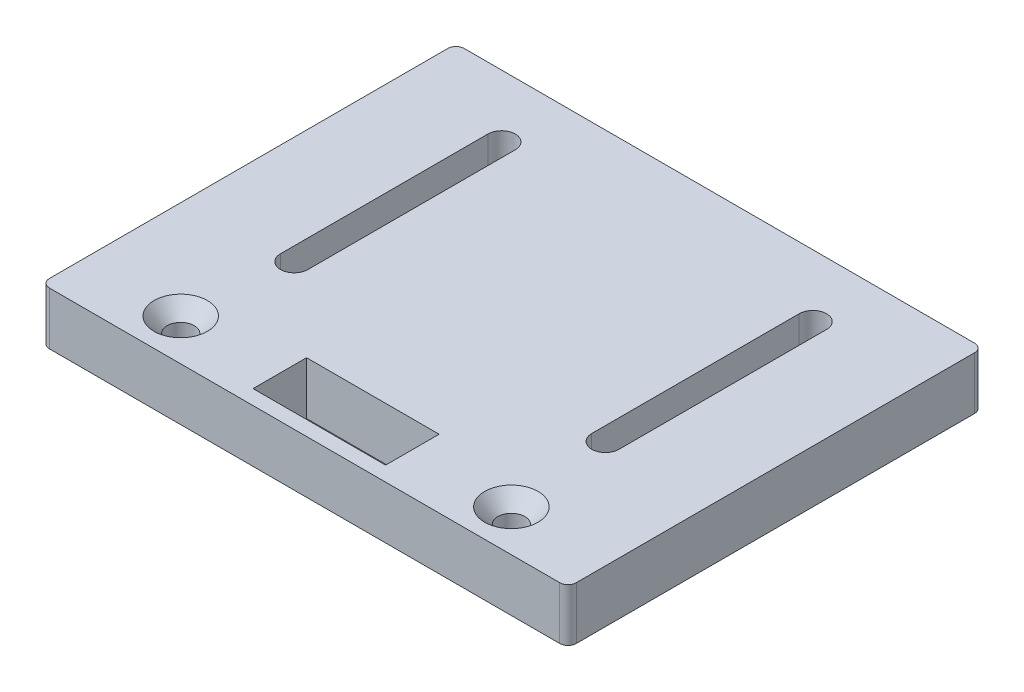
ISO-10303-21;
HEADER;
FILE_DESCRIPTION(('STEP AP214'),'2;1');
FILE_NAME('part.step','',(''),(''),'','','');
FILE_SCHEMA(('AUTOMOTIVE_DESIGN { 1 0 10303 214 1 1 1 1 }'));
ENDSEC;
DATA;
#1=APPLICATION_CONTEXT('core data for automotive mechanical design processes');
#2=APPLICATION_PROTOCOL_DEFINITION('international standard','automotive_design',2000,#1);
#3=PRODUCT_CONTEXT('',#1,'mechanical');
#4=PRODUCT('Part','Part','',(#3));
#5=PRODUCT_RELATED_PRODUCT_CATEGORY('part','',(#4));
#6=PRODUCT_DEFINITION_FORMATION('','',#4);
#7=PRODUCT_DEFINITION_CONTEXT('part definition',#1,'design');
#8=PRODUCT_DEFINITION('design','',#6,#7);
#9=PRODUCT_DEFINITION_SHAPE('','',#8);
#10=(LENGTH_UNIT() NAMED_UNIT(*) SI_UNIT(.MILLI.,.METRE.));
#11=(NAMED_UNIT(*) PLANE_ANGLE_UNIT() SI_UNIT($,.RADIAN.));
#12=(NAMED_UNIT(*) SI_UNIT($,.STERADIAN.) SOLID_ANGLE_UNIT());
#13=UNCERTAINTY_MEASURE_WITH_UNIT(LENGTH_MEASURE(1.E-05),#10,'distance_accuracy_value','');
#14=(GEOMETRIC_REPRESENTATION_CONTEXT(3) GLOBAL_UNCERTAINTY_ASSIGNED_CONTEXT((#13)) GLOBAL_UNIT_ASSIGNED_CONTEXT((#10,
#11,#12)) REPRESENTATION_CONTEXT('',''));
#15=CARTESIAN_POINT('',(0.,0.,0.));
#16=DIRECTION('',(0.,0.,1.));
#17=DIRECTION('',(1.,0.,0.));
#18=AXIS2_PLACEMENT_3D('',#15,#16,#17);
#19=CARTESIAN_POINT('',(0.,12.7,0.));
#20=DIRECTION('',(0.,-1.,0.));
#21=DIRECTION('',(0.,0.,-1.));
#22=AXIS2_PLACEMENT_3D('',#19,#20,#21);
#23=PLANE('',#22);
#24=CARTESIAN_POINT('',(23.65,12.7,-9.99689239735138));
#25=DIRECTION('',(0.,1.,0.));
#26=DIRECTION('',(0.,0.,1.));
#27=AXIS2_PLACEMENT_3D('',#24,#25,#26);
#28=CIRCLE('',#27,6.4389);
#29=CARTESIAN_POINT('',(23.65,12.7,-3.55799239735138));
#30=VERTEX_POINT('',#29);
#31=EDGE_CURVE('E637',#30,#30,#28,.T.);
#32=ORIENTED_EDGE('',*,*,#31,.F.);
#33=EDGE_LOOP('',(#32));
#34=FACE_BOUND('',#33,.T.);
#35=DIRECTION('',(0.,0.,1.));
#36=VECTOR('',#35,1.);
#37=CARTESIAN_POINT('',(97.7208470920654,12.7,-35.0000046193213));
#38=LINE('',#37,#36);
#39=CARTESIAN_POINT('',(97.7208470920654,12.7,-84.9999953806787));
#40=VERTEX_POINT('',#39);
#41=CARTESIAN_POINT('',(97.7208470920654,12.7,-35.0000046193213));
#42=VERTEX_POINT('',#41);
#43=EDGE_CURVE('E211',#40,#42,#38,.T.);
#44=ORIENTED_EDGE('',*,*,#43,.F.);
#45=CARTESIAN_POINT('',(101.020847092062,12.7,-85.));
#46=DIRECTION('',(0.,1.,0.));
#47=DIRECTION('',(0.,0.,-1.));
#48=AXIS2_PLACEMENT_3D('',#45,#46,#47);
#49=CIRCLE('',#48,3.30000000000001);
#50=CARTESIAN_POINT('',(104.309142680216,12.7,-85.2776907001068));
#51=VERTEX_POINT('',#50);
#52=EDGE_CURVE('E181',#51,#40,#49,.T.);
#53=ORIENTED_EDGE('',*,*,#52,.F.);
#54=DIRECTION('',(0.,0.,-1.));
#55=VECTOR('',#54,1.);
#56=CARTESIAN_POINT('',(104.309142680216,12.7,-35.2776907001068));
#57=LINE('',#56,#55);
#58=CARTESIAN_POINT('',(104.309142680216,12.7,-35.2776907001068));
#59=VERTEX_POINT('',#58);
#60=EDGE_CURVE('E199',#59,#51,#57,.T.);
#61=ORIENTED_EDGE('',*,*,#60,.F.);
#62=CARTESIAN_POINT('',(101.020847092062,12.7,-35.0000000000001));
#63=DIRECTION('',(0.,1.,0.));
#64=DIRECTION('',(0.,0.,-1.));
#65=AXIS2_PLACEMENT_3D('',#62,#63,#64);
#66=CIRCLE('',#65,3.3);
#67=EDGE_CURVE('E202',#42,#59,#66,.T.);
#68=ORIENTED_EDGE('',*,*,#67,.F.);
#69=EDGE_LOOP('',(#44,#53,#61,#68));
#70=FACE_BOUND('',#69,.T.);
#71=DIRECTION('',(0.,0.,-1.));
#72=VECTOR('',#71,1.);
#73=CARTESIAN_POINT('',(29.2908470920654,12.7,-35.));
#74=LINE('',#73,#72);
#75=CARTESIAN_POINT('',(29.2908470920654,12.7,-35.));
#76=VERTEX_POINT('',#75);
#77=CARTESIAN_POINT('',(29.2908470920654,12.7,-85.));
#78=VERTEX_POINT('',#77);
#79=EDGE_CURVE('E238',#76,#78,#74,.T.);
#80=ORIENTED_EDGE('',*,*,#79,.F.);
#81=CARTESIAN_POINT('',(25.9908470920654,12.7,-35.));
#82=DIRECTION('',(0.,1.,0.));
#83=DIRECTION('',(0.,0.,1.));
#84=AXIS2_PLACEMENT_3D('',#81,#82,#83);
#85=CIRCLE('',#84,3.3);
#86=CARTESIAN_POINT('',(22.6908470920654,12.7,-35.));
#87=VERTEX_POINT('',#86);
#88=EDGE_CURVE('E236',#87,#76,#85,.T.);
#89=ORIENTED_EDGE('',*,*,#88,.F.);
#90=DIRECTION('',(0.,0.,1.));
#91=VECTOR('',#90,1.);
#92=CARTESIAN_POINT('',(22.6908470920654,12.7,-35.));
#93=LINE('',#92,#91);
#94=CARTESIAN_POINT('',(22.6908470920654,12.7,-85.));
#95=VERTEX_POINT('',#94);
#96=EDGE_CURVE('E226',#95,#87,#93,.T.);
#97=ORIENTED_EDGE('',*,*,#96,.F.);
#98=CARTESIAN_POINT('',(25.9908470920654,12.7,-85.));
#99=DIRECTION('',(0.,1.,0.));
#100=DIRECTION('',(0.,0.,1.));
#101=AXIS2_PLACEMENT_3D('',#98,#99,#100);
#102=CIRCLE('',#101,3.3);
#103=EDGE_CURVE('E241',#78,#95,#102,.T.);
#104=ORIENTED_EDGE('',*,*,#103,.F.);
#105=EDGE_LOOP('',(#80,#89,#97,#104));
#106=FACE_BOUND('',#105,.T.);
#107=DIRECTION('',(1.,0.,0.));
#108=VECTOR('',#107,1.);
#109=CARTESIAN_POINT('',(47.53,12.7,-3.55));
#110=LINE('',#109,#108);
#111=CARTESIAN_POINT('',(47.53,12.7,-3.55));
#112=VERTEX_POINT('',#111);
#113=CARTESIAN_POINT('',(79.48,12.7,-3.55));
#114=VERTEX_POINT('',#113);
#115=EDGE_CURVE('E218',#112,#114,#110,.T.);
#116=ORIENTED_EDGE('',*,*,#115,.F.);
#117=DIRECTION('',(0.,0.,1.));
#118=VECTOR('',#117,1.);
#119=CARTESIAN_POINT('',(47.53,12.7,-10.));
#120=LINE('',#119,#118);
#121=CARTESIAN_POINT('',(47.53,12.7,-16.45));
#122=VERTEX_POINT('',#121);
#123=EDGE_CURVE('E257',#122,#112,#120,.T.);
#124=ORIENTED_EDGE('',*,*,#123,.F.);
#125=DIRECTION('',(-1.,0.,0.));
#126=VECTOR('',#125,1.);
#127=CARTESIAN_POINT('',(47.53,12.7,-16.45));
#128=LINE('',#127,#126);
#129=CARTESIAN_POINT('',(79.48,12.7,-16.45));
#130=VERTEX_POINT('',#129);
#131=EDGE_CURVE('E272',#130,#122,#128,.T.);
#132=ORIENTED_EDGE('',*,*,#131,.F.);
#133=DIRECTION('',(0.,0.,-1.));
#134=VECTOR('',#133,1.);
#135=CARTESIAN_POINT('',(79.48,12.7,-10.));
#136=LINE('',#135,#134);
#137=EDGE_CURVE('E269',#114,#130,#136,.T.);
#138=ORIENTED_EDGE('',*,*,#137,.F.);
#139=EDGE_LOOP('',(#116,#124,#132,#138));
#140=FACE_BOUND('',#139,.T.);
#141=DIRECTION('',(0.,0.,-1.));
#142=VECTOR('',#141,1.);
#143=CARTESIAN_POINT('',(127.,12.7,0.));
#144=LINE('',#143,#142);
#145=CARTESIAN_POINT('',(127.,12.7,-2.));
#146=VERTEX_POINT('',#145);
#147=CARTESIAN_POINT('',(127.,12.7,-98.));
#148=VERTEX_POINT('',#147);
#149=EDGE_CURVE('E290',#146,#148,#144,.T.);
#150=ORIENTED_EDGE('',*,*,#149,.T.);
#151=CARTESIAN_POINT('',(125.,12.7,-98.));
#152=DIRECTION('',(0.,-1.,0.));
#153=DIRECTION('',(0.,0.,-1.));
#154=AXIS2_PLACEMENT_3D('',#151,#152,#153);
#155=CIRCLE('',#154,2.);
#156=CARTESIAN_POINT('',(125.,12.7,-100.));
#157=VERTEX_POINT('',#156);
#158=EDGE_CURVE('E328',#148,#157,#155,.F.);
#159=ORIENTED_EDGE('',*,*,#158,.T.);
#160=DIRECTION('',(-1.,0.,0.));
#161=VECTOR('',#160,1.);
#162=CARTESIAN_POINT('',(0.,12.7,-100.));
#163=LINE('',#162,#161);
#164=CARTESIAN_POINT('',(2.,12.7,-100.));
#165=VERTEX_POINT('',#164);
#166=EDGE_CURVE('E293',#157,#165,#163,.T.);
#167=ORIENTED_EDGE('',*,*,#166,.T.);
#168=CARTESIAN_POINT('',(2.,12.7,-98.));
#169=DIRECTION('',(0.,-1.,0.));
#170=DIRECTION('',(0.,0.,-1.));
#171=AXIS2_PLACEMENT_3D('',#168,#169,#170);
#172=CIRCLE('',#171,2.);
#173=CARTESIAN_POINT('',(0.,12.7,-98.));
#174=VERTEX_POINT('',#173);
#175=EDGE_CURVE('E323',#165,#174,#172,.F.);
#176=ORIENTED_EDGE('',*,*,#175,.T.);
#177=DIRECTION('',(0.,0.,1.));
#178=VECTOR('',#177,1.);
#179=CARTESIAN_POINT('',(0.,12.7,0.));
#180=LINE('',#179,#178);
#181=CARTESIAN_POINT('',(0.,12.7,-2.));
#182=VERTEX_POINT('',#181);
#183=EDGE_CURVE('E285',#174,#182,#180,.T.);
#184=ORIENTED_EDGE('',*,*,#183,.T.);
#185=CARTESIAN_POINT('',(2.,12.7,-2.));
#186=DIRECTION('',(0.,-1.,0.));
#187=DIRECTION('',(0.,0.,-1.));
#188=AXIS2_PLACEMENT_3D('',#185,#186,#187);
#189=CIRCLE('',#188,2.);
#190=CARTESIAN_POINT('',(2.,12.7,0.));
#191=VERTEX_POINT('',#190);
#192=EDGE_CURVE('E58',#182,#191,#189,.F.);
#193=ORIENTED_EDGE('',*,*,#192,.T.);
#194=DIRECTION('',(1.,0.,0.));
#195=VECTOR('',#194,1.);
#196=CARTESIAN_POINT('',(0.,12.7,0.));
#197=LINE('',#196,#195);
#198=CARTESIAN_POINT('',(125.,12.7,0.));
#199=VERTEX_POINT('',#198);
#200=EDGE_CURVE('E287',#191,#199,#197,.T.);
#201=ORIENTED_EDGE('',*,*,#200,.T.);
#202=CARTESIAN_POINT('',(125.,12.7,-2.));
#203=DIRECTION('',(0.,-1.,0.));
#204=DIRECTION('',(0.,0.,-1.));
#205=AXIS2_PLACEMENT_3D('',#202,#203,#204);
#206=CIRCLE('',#205,2.);
#207=EDGE_CURVE('E326',#199,#146,#206,.F.);
#208=ORIENTED_EDGE('',*,*,#207,.T.);
#209=EDGE_LOOP('',(#150,#159,#167,#176,#184,#193,#201,#208));
#210=FACE_BOUND('',#209,.T.);
#211=CARTESIAN_POINT('',(103.35,12.7,-9.99689239735138));
#212=DIRECTION('',(0.,1.,0.));
#213=DIRECTION('',(0.,0.,1.));
#214=AXIS2_PLACEMENT_3D('',#211,#212,#213);
#215=CIRCLE('',#214,6.4389);
#216=CARTESIAN_POINT('',(103.35,12.7,-3.55799239735138));
#217=VERTEX_POINT('',#216);
#218=EDGE_CURVE('E644',#217,#217,#215,.T.);
#219=ORIENTED_EDGE('',*,*,#218,.F.);
#220=EDGE_LOOP('',(#219));
#221=FACE_BOUND('',#220,.T.);
#222=ADVANCED_FACE('F36',(#34,#70,#106,#140,#210,#221),#23,.F.);
#223=CARTESIAN_POINT('',(0.,12.7,0.));
#224=DIRECTION('',(1.,0.,0.));
#225=DIRECTION('',(0.,0.,-1.));
#226=AXIS2_PLACEMENT_3D('',#223,#224,#225);
#227=PLANE('',#226);
#228=DIRECTION('',(0.,0.,1.));
#229=VECTOR('',#228,1.);
#230=CARTESIAN_POINT('',(0.,0.,0.));
#231=LINE('',#230,#229);
#232=CARTESIAN_POINT('',(0.,0.,-98.));
#233=VERTEX_POINT('',#232);
#234=CARTESIAN_POINT('',(0.,0.,-2.));
#235=VERTEX_POINT('',#234);
#236=EDGE_CURVE('E279',#233,#235,#231,.T.);
#237=ORIENTED_EDGE('',*,*,#236,.T.);
#238=DIRECTION('',(0.,-1.,0.));
#239=VECTOR('',#238,1.);
#240=CARTESIAN_POINT('',(0.,12.7,-2.));
#241=LINE('',#240,#239);
#242=EDGE_CURVE('E11',#235,#182,#241,.F.);
#243=ORIENTED_EDGE('',*,*,#242,.T.);
#244=ORIENTED_EDGE('',*,*,#183,.F.);
#245=DIRECTION('',(0.,-1.,0.));
#246=VECTOR('',#245,1.);
#247=CARTESIAN_POINT('',(0.,12.7,-98.));
#248=LINE('',#247,#246);
#249=EDGE_CURVE('E44',#174,#233,#248,.T.);
#250=ORIENTED_EDGE('',*,*,#249,.T.);
#251=EDGE_LOOP('',(#237,#243,#244,#250));
#252=FACE_BOUND('',#251,.T.);
#253=ADVANCED_FACE('F338',(#252),#227,.F.);
#254=CARTESIAN_POINT('',(0.,12.7,0.));
#255=DIRECTION('',(0.,0.,-1.));
#256=DIRECTION('',(-1.,0.,0.));
#257=AXIS2_PLACEMENT_3D('',#254,#255,#256);
#258=PLANE('',#257);
#259=DIRECTION('',(1.,0.,0.));
#260=VECTOR('',#259,1.);
#261=CARTESIAN_POINT('',(0.,0.,0.));
#262=LINE('',#261,#260);
#263=CARTESIAN_POINT('',(2.,0.,0.));
#264=VERTEX_POINT('',#263);
#265=CARTESIAN_POINT('',(125.,0.,0.));
#266=VERTEX_POINT('',#265);
#267=EDGE_CURVE('E299',#264,#266,#262,.T.);
#268=ORIENTED_EDGE('',*,*,#267,.T.);
#269=DIRECTION('',(0.,-1.,0.));
#270=VECTOR('',#269,1.);
#271=CARTESIAN_POINT('',(125.,12.7,0.));
#272=LINE('',#271,#270);
#273=EDGE_CURVE('E51',#266,#199,#272,.F.);
#274=ORIENTED_EDGE('',*,*,#273,.T.);
#275=ORIENTED_EDGE('',*,*,#200,.F.);
#276=DIRECTION('',(0.,-1.,0.));
#277=VECTOR('',#276,1.);
#278=CARTESIAN_POINT('',(2.,12.7,0.));
#279=LINE('',#278,#277);
#280=EDGE_CURVE('E330',#191,#264,#279,.T.);
#281=ORIENTED_EDGE('',*,*,#280,.T.);
#282=EDGE_LOOP('',(#268,#274,#275,#281));
#283=FACE_BOUND('',#282,.T.);
#284=ADVANCED_FACE('F348',(#283),#258,.F.);
#285=CARTESIAN_POINT('',(127.,12.7,0.));
#286=DIRECTION('',(-1.,0.,0.));
#287=DIRECTION('',(0.,0.,1.));
#288=AXIS2_PLACEMENT_3D('',#285,#286,#287);
#289=PLANE('',#288);
#290=DIRECTION('',(0.,0.,-1.));
#291=VECTOR('',#290,1.);
#292=CARTESIAN_POINT('',(127.,0.,0.));
#293=LINE('',#292,#291);
#294=CARTESIAN_POINT('',(127.,0.,-2.));
#295=VERTEX_POINT('',#294);
#296=CARTESIAN_POINT('',(127.,0.,-98.));
#297=VERTEX_POINT('',#296);
#298=EDGE_CURVE('E301',#295,#297,#293,.T.);
#299=ORIENTED_EDGE('',*,*,#298,.T.);
#300=DIRECTION('',(0.,-1.,0.));
#301=VECTOR('',#300,1.);
#302=CARTESIAN_POINT('',(127.,12.7,-98.));
#303=LINE('',#302,#301);
#304=EDGE_CURVE('E321',#297,#148,#303,.F.);
#305=ORIENTED_EDGE('',*,*,#304,.T.);
#306=ORIENTED_EDGE('',*,*,#149,.F.);
#307=DIRECTION('',(0.,-1.,0.));
#308=VECTOR('',#307,1.);
#309=CARTESIAN_POINT('',(127.,12.7,-2.));
#310=LINE('',#309,#308);
#311=EDGE_CURVE('E318',#146,#295,#310,.T.);
#312=ORIENTED_EDGE('',*,*,#311,.T.);
#313=EDGE_LOOP('',(#299,#305,#306,#312));
#314=FACE_BOUND('',#313,.T.);
#315=ADVANCED_FACE('F357',(#314),#289,.F.);
#316=CARTESIAN_POINT('',(0.,12.7,-100.));
#317=DIRECTION('',(0.,0.,1.));
#318=DIRECTION('',(1.,0.,0.));
#319=AXIS2_PLACEMENT_3D('',#316,#317,#318);
#320=PLANE('',#319);
#321=ORIENTED_EDGE('',*,*,#166,.F.);
#322=DIRECTION('',(0.,-1.,0.));
#323=VECTOR('',#322,1.);
#324=CARTESIAN_POINT('',(125.,12.7,-100.));
#325=LINE('',#324,#323);
#326=CARTESIAN_POINT('',(125.,0.,-100.));
#327=VERTEX_POINT('',#326);
#328=EDGE_CURVE('E307',#157,#327,#325,.T.);
#329=ORIENTED_EDGE('',*,*,#328,.T.);
#330=DIRECTION('',(-1.,0.,0.));
#331=VECTOR('',#330,1.);
#332=CARTESIAN_POINT('',(0.,0.,-100.));
#333=LINE('',#332,#331);
#334=CARTESIAN_POINT('',(2.,0.,-100.));
#335=VERTEX_POINT('',#334);
#336=EDGE_CURVE('E288',#327,#335,#333,.T.);
#337=ORIENTED_EDGE('',*,*,#336,.T.);
#338=DIRECTION('',(0.,-1.,0.));
#339=VECTOR('',#338,1.);
#340=CARTESIAN_POINT('',(2.,12.7,-100.));
#341=LINE('',#340,#339);
#342=EDGE_CURVE('E296',#335,#165,#341,.F.);
#343=ORIENTED_EDGE('',*,*,#342,.T.);
#344=EDGE_LOOP('',(#321,#329,#337,#343));
#345=FACE_BOUND('',#344,.T.);
#346=ADVANCED_FACE('F365',(#345),#320,.F.);
#347=CARTESIAN_POINT('',(0.,0.,0.));
#348=DIRECTION('',(0.,-1.,0.));
#349=DIRECTION('',(0.,0.,-1.));
#350=AXIS2_PLACEMENT_3D('',#347,#348,#349);
#351=PLANE('',#350);
#352=CARTESIAN_POINT('',(23.65,0.,-9.99689239735138));
#353=DIRECTION('',(0.,1.,0.));
#354=DIRECTION('',(0.,0.,1.));
#355=AXIS2_PLACEMENT_3D('',#352,#353,#354);
#356=CIRCLE('',#355,3.26389999999999);
#357=CARTESIAN_POINT('',(23.65,0.,-6.73299239735139));
#358=VERTEX_POINT('',#357);
#359=EDGE_CURVE('E639',#358,#358,#356,.T.);
#360=ORIENTED_EDGE('',*,*,#359,.T.);
#361=EDGE_LOOP('',(#360));
#362=FACE_BOUND('',#361,.T.);
#363=CARTESIAN_POINT('',(103.35,0.,-9.99689239735138));
#364=DIRECTION('',(0.,1.,0.));
#365=DIRECTION('',(0.,0.,1.));
#366=AXIS2_PLACEMENT_3D('',#363,#364,#365);
#367=CIRCLE('',#366,3.26389999999999);
#368=CARTESIAN_POINT('',(103.35,0.,-6.73299239735139));
#369=VERTEX_POINT('',#368);
#370=EDGE_CURVE('E205',#369,#369,#367,.T.);
#371=ORIENTED_EDGE('',*,*,#370,.T.);
#372=EDGE_LOOP('',(#371));
#373=FACE_BOUND('',#372,.T.);
#374=CARTESIAN_POINT('',(101.020847092062,0.,-85.));
#375=DIRECTION('',(0.,1.,0.));
#376=DIRECTION('',(0.,0.,-1.));
#377=AXIS2_PLACEMENT_3D('',#374,#375,#376);
#378=CIRCLE('',#377,3.30000000000001);
#379=CARTESIAN_POINT('',(104.309142680216,0.,-85.2776907001068));
#380=VERTEX_POINT('',#379);
#381=CARTESIAN_POINT('',(97.7208470920654,0.,-84.9999953806787));
#382=VERTEX_POINT('',#381);
#383=EDGE_CURVE('E178',#380,#382,#378,.T.);
#384=ORIENTED_EDGE('',*,*,#383,.T.);
#385=DIRECTION('',(0.,0.,1.));
#386=VECTOR('',#385,1.);
#387=CARTESIAN_POINT('',(97.7208470920654,0.,-35.0000046193213));
#388=LINE('',#387,#386);
#389=CARTESIAN_POINT('',(97.7208470920654,0.,-35.0000046193213));
#390=VERTEX_POINT('',#389);
#391=EDGE_CURVE('E190',#382,#390,#388,.T.);
#392=ORIENTED_EDGE('',*,*,#391,.T.);
#393=CARTESIAN_POINT('',(101.020847092062,0.,-35.0000000000001));
#394=DIRECTION('',(0.,1.,0.));
#395=DIRECTION('',(0.,0.,-1.));
#396=AXIS2_PLACEMENT_3D('',#393,#394,#395);
#397=CIRCLE('',#396,3.3);
#398=CARTESIAN_POINT('',(104.309142680216,0.,-35.2776907001068));
#399=VERTEX_POINT('',#398);
#400=EDGE_CURVE('E194',#390,#399,#397,.T.);
#401=ORIENTED_EDGE('',*,*,#400,.T.);
#402=DIRECTION('',(0.,0.,-1.));
#403=VECTOR('',#402,1.);
#404=CARTESIAN_POINT('',(104.309142680216,0.,-35.2776907001068));
#405=LINE('',#404,#403);
#406=EDGE_CURVE('E186',#399,#380,#405,.T.);
#407=ORIENTED_EDGE('',*,*,#406,.T.);
#408=EDGE_LOOP('',(#384,#392,#401,#407));
#409=FACE_BOUND('',#408,.T.);
#410=CARTESIAN_POINT('',(25.9908470920654,0.,-35.));
#411=DIRECTION('',(0.,1.,0.));
#412=DIRECTION('',(0.,0.,1.));
#413=AXIS2_PLACEMENT_3D('',#410,#411,#412);
#414=CIRCLE('',#413,3.3);
#415=CARTESIAN_POINT('',(22.6908470920654,0.,-35.));
#416=VERTEX_POINT('',#415);
#417=CARTESIAN_POINT('',(29.2908470920654,0.,-35.));
#418=VERTEX_POINT('',#417);
#419=EDGE_CURVE('E222',#416,#418,#414,.T.);
#420=ORIENTED_EDGE('',*,*,#419,.T.);
#421=DIRECTION('',(0.,0.,-1.));
#422=VECTOR('',#421,1.);
#423=CARTESIAN_POINT('',(29.2908470920654,0.,-35.));
#424=LINE('',#423,#422);
#425=CARTESIAN_POINT('',(29.2908470920654,0.,-85.));
#426=VERTEX_POINT('',#425);
#427=EDGE_CURVE('E225',#418,#426,#424,.T.);
#428=ORIENTED_EDGE('',*,*,#427,.T.);
#429=CARTESIAN_POINT('',(25.9908470920654,0.,-85.));
#430=DIRECTION('',(0.,1.,0.));
#431=DIRECTION('',(0.,0.,1.));
#432=AXIS2_PLACEMENT_3D('',#429,#430,#431);
#433=CIRCLE('',#432,3.3);
#434=CARTESIAN_POINT('',(22.6908470920654,0.,-85.));
#435=VERTEX_POINT('',#434);
#436=EDGE_CURVE('E229',#426,#435,#433,.T.);
#437=ORIENTED_EDGE('',*,*,#436,.T.);
#438=DIRECTION('',(0.,0.,1.));
#439=VECTOR('',#438,1.);
#440=CARTESIAN_POINT('',(22.6908470920654,0.,-35.));
#441=LINE('',#440,#439);
#442=EDGE_CURVE('E232',#435,#416,#441,.T.);
#443=ORIENTED_EDGE('',*,*,#442,.T.);
#444=EDGE_LOOP('',(#420,#428,#437,#443));
#445=FACE_BOUND('',#444,.T.);
#446=DIRECTION('',(0.,0.,1.));
#447=VECTOR('',#446,1.);
#448=CARTESIAN_POINT('',(47.53,0.,-10.));
#449=LINE('',#448,#447);
#450=CARTESIAN_POINT('',(47.53,0.,-16.45));
#451=VERTEX_POINT('',#450);
#452=CARTESIAN_POINT('',(47.53,0.,-3.55));
#453=VERTEX_POINT('',#452);
#454=EDGE_CURVE('E253',#451,#453,#449,.T.);
#455=ORIENTED_EDGE('',*,*,#454,.T.);
#456=DIRECTION('',(1.,0.,0.));
#457=VECTOR('',#456,1.);
#458=CARTESIAN_POINT('',(47.53,0.,-3.55));
#459=LINE('',#458,#457);
#460=CARTESIAN_POINT('',(79.48,0.,-3.55));
#461=VERTEX_POINT('',#460);
#462=EDGE_CURVE('E256',#453,#461,#459,.T.);
#463=ORIENTED_EDGE('',*,*,#462,.T.);
#464=DIRECTION('',(0.,0.,-1.));
#465=VECTOR('',#464,1.);
#466=CARTESIAN_POINT('',(79.48,0.,-3.55));
#467=LINE('',#466,#465);
#468=CARTESIAN_POINT('',(79.48,0.,-16.45));
#469=VERTEX_POINT('',#468);
#470=EDGE_CURVE('E260',#461,#469,#467,.T.);
#471=ORIENTED_EDGE('',*,*,#470,.T.);
#472=DIRECTION('',(-1.,0.,0.));
#473=VECTOR('',#472,1.);
#474=CARTESIAN_POINT('',(47.53,0.,-16.45));
#475=LINE('',#474,#473);
#476=EDGE_CURVE('E263',#469,#451,#475,.T.);
#477=ORIENTED_EDGE('',*,*,#476,.T.);
#478=EDGE_LOOP('',(#455,#463,#471,#477));
#479=FACE_BOUND('',#478,.T.);
#480=ORIENTED_EDGE('',*,*,#336,.F.);
#481=CARTESIAN_POINT('',(125.,0.,-98.));
#482=DIRECTION('',(0.,-1.,0.));
#483=DIRECTION('',(0.,0.,-1.));
#484=AXIS2_PLACEMENT_3D('',#481,#482,#483);
#485=CIRCLE('',#484,2.);
#486=EDGE_CURVE('E316',#327,#297,#485,.T.);
#487=ORIENTED_EDGE('',*,*,#486,.T.);
#488=ORIENTED_EDGE('',*,*,#298,.F.);
#489=CARTESIAN_POINT('',(125.,0.,-2.));
#490=DIRECTION('',(0.,-1.,0.));
#491=DIRECTION('',(0.,0.,-1.));
#492=AXIS2_PLACEMENT_3D('',#489,#490,#491);
#493=CIRCLE('',#492,2.);
#494=EDGE_CURVE('E314',#295,#266,#493,.T.);
#495=ORIENTED_EDGE('',*,*,#494,.T.);
#496=ORIENTED_EDGE('',*,*,#267,.F.);
#497=CARTESIAN_POINT('',(2.,0.,-2.));
#498=DIRECTION('',(0.,-1.,0.));
#499=DIRECTION('',(0.,0.,-1.));
#500=AXIS2_PLACEMENT_3D('',#497,#498,#499);
#501=CIRCLE('',#500,2.);
#502=EDGE_CURVE('E312',#264,#235,#501,.T.);
#503=ORIENTED_EDGE('',*,*,#502,.T.);
#504=ORIENTED_EDGE('',*,*,#236,.F.);
#505=CARTESIAN_POINT('',(2.,0.,-98.));
#506=DIRECTION('',(0.,-1.,0.));
#507=DIRECTION('',(0.,0.,-1.));
#508=AXIS2_PLACEMENT_3D('',#505,#506,#507);
#509=CIRCLE('',#508,2.);
#510=EDGE_CURVE('E310',#233,#335,#509,.T.);
#511=ORIENTED_EDGE('',*,*,#510,.T.);
#512=EDGE_LOOP('',(#480,#487,#488,#495,#496,#503,#504,#511));
#513=FACE_BOUND('',#512,.T.);
#514=ADVANCED_FACE('F196',(#362,#373,#409,#445,#479,#513),#351,.T.);
#515=CARTESIAN_POINT('',(47.53,0.,-10.));
#516=DIRECTION('',(-1.,0.,0.));
#517=DIRECTION('',(0.,0.,1.));
#518=AXIS2_PLACEMENT_3D('',#515,#516,#517);
#519=PLANE('',#518);
#520=ORIENTED_EDGE('',*,*,#123,.T.);
#521=DIRECTION('',(0.,1.,0.));
#522=VECTOR('',#521,1.);
#523=CARTESIAN_POINT('',(47.53,0.,-3.55));
#524=LINE('',#523,#522);
#525=EDGE_CURVE('E266',#453,#112,#524,.T.);
#526=ORIENTED_EDGE('',*,*,#525,.F.);
#527=ORIENTED_EDGE('',*,*,#454,.F.);
#528=DIRECTION('',(0.,1.,0.));
#529=VECTOR('',#528,1.);
#530=CARTESIAN_POINT('',(47.53,0.,-16.45));
#531=LINE('',#530,#529);
#532=EDGE_CURVE('E277',#451,#122,#531,.T.);
#533=ORIENTED_EDGE('',*,*,#532,.T.);
#534=EDGE_LOOP('',(#520,#526,#527,#533));
#535=FACE_BOUND('',#534,.T.);
#536=ADVANCED_FACE('F391',(#535),#519,.F.);
#537=CARTESIAN_POINT('',(47.53,0.,-16.45));
#538=DIRECTION('',(0.,0.,-1.));
#539=DIRECTION('',(-1.,0.,0.));
#540=AXIS2_PLACEMENT_3D('',#537,#538,#539);
#541=PLANE('',#540);
#542=ORIENTED_EDGE('',*,*,#131,.T.);
#543=ORIENTED_EDGE('',*,*,#532,.F.);
#544=ORIENTED_EDGE('',*,*,#476,.F.);
#545=DIRECTION('',(0.,1.,0.));
#546=VECTOR('',#545,1.);
#547=CARTESIAN_POINT('',(79.48,0.,-16.45));
#548=LINE('',#547,#546);
#549=EDGE_CURVE('E280',#469,#130,#548,.T.);
#550=ORIENTED_EDGE('',*,*,#549,.T.);
#551=EDGE_LOOP('',(#542,#543,#544,#550));
#552=FACE_BOUND('',#551,.T.);
#553=ADVANCED_FACE('F498',(#552),#541,.F.);
#554=CARTESIAN_POINT('',(79.48,0.,-10.));
#555=DIRECTION('',(1.,0.,0.));
#556=DIRECTION('',(0.,0.,-1.));
#557=AXIS2_PLACEMENT_3D('',#554,#555,#556);
#558=PLANE('',#557);
#559=ORIENTED_EDGE('',*,*,#137,.T.);
#560=ORIENTED_EDGE('',*,*,#549,.F.);
#561=ORIENTED_EDGE('',*,*,#470,.F.);
#562=DIRECTION('',(0.,1.,0.));
#563=VECTOR('',#562,1.);
#564=CARTESIAN_POINT('',(79.48,0.,-3.55));
#565=LINE('',#564,#563);
#566=EDGE_CURVE('E282',#461,#114,#565,.T.);
#567=ORIENTED_EDGE('',*,*,#566,.T.);
#568=EDGE_LOOP('',(#559,#560,#561,#567));
#569=FACE_BOUND('',#568,.T.);
#570=ADVANCED_FACE('F501',(#569),#558,.F.);
#571=CARTESIAN_POINT('',(47.53,0.,-3.55));
#572=DIRECTION('',(0.,0.,1.));
#573=DIRECTION('',(1.,0.,0.));
#574=AXIS2_PLACEMENT_3D('',#571,#572,#573);
#575=PLANE('',#574);
#576=ORIENTED_EDGE('',*,*,#115,.T.);
#577=ORIENTED_EDGE('',*,*,#566,.F.);
#578=ORIENTED_EDGE('',*,*,#462,.F.);
#579=ORIENTED_EDGE('',*,*,#525,.T.);
#580=EDGE_LOOP('',(#576,#577,#578,#579));
#581=FACE_BOUND('',#580,.T.);
#582=ADVANCED_FACE('F387',(#581),#575,.F.);
#583=CARTESIAN_POINT('',(25.9908470920654,0.,-35.));
#584=DIRECTION('',(0.,1.,0.));
#585=DIRECTION('',(0.,0.,1.));
#586=AXIS2_PLACEMENT_3D('',#583,#584,#585);
#587=CYLINDRICAL_SURFACE('',#586,3.3);
#588=ORIENTED_EDGE('',*,*,#88,.T.);
#589=DIRECTION('',(0.,1.,0.));
#590=VECTOR('',#589,1.);
#591=CARTESIAN_POINT('',(29.2908470920654,0.,-35.));
#592=LINE('',#591,#590);
#593=EDGE_CURVE('E235',#418,#76,#592,.T.);
#594=ORIENTED_EDGE('',*,*,#593,.F.);
#595=ORIENTED_EDGE('',*,*,#419,.F.);
#596=DIRECTION('',(0.,1.,0.));
#597=VECTOR('',#596,1.);
#598=CARTESIAN_POINT('',(22.6908470920654,0.,-35.));
#599=LINE('',#598,#597);
#600=EDGE_CURVE('E212',#416,#87,#599,.T.);
#601=ORIENTED_EDGE('',*,*,#600,.T.);
#602=EDGE_LOOP('',(#588,#594,#595,#601));
#603=FACE_BOUND('',#602,.T.);
#604=ADVANCED_FACE('F486',(#603),#587,.F.);
#605=CARTESIAN_POINT('',(22.6908470920654,0.,-35.));
#606=DIRECTION('',(-1.,0.,0.));
#607=DIRECTION('',(0.,0.,1.));
#608=AXIS2_PLACEMENT_3D('',#605,#606,#607);
#609=PLANE('',#608);
#610=ORIENTED_EDGE('',*,*,#96,.T.);
#611=ORIENTED_EDGE('',*,*,#600,.F.);
#612=ORIENTED_EDGE('',*,*,#442,.F.);
#613=DIRECTION('',(0.,1.,0.));
#614=VECTOR('',#613,1.);
#615=CARTESIAN_POINT('',(22.6908470920654,0.,-85.));
#616=LINE('',#615,#614);
#617=EDGE_CURVE('E247',#435,#95,#616,.T.);
#618=ORIENTED_EDGE('',*,*,#617,.T.);
#619=EDGE_LOOP('',(#610,#611,#612,#618));
#620=FACE_BOUND('',#619,.T.);
#621=ADVANCED_FACE('F482',(#620),#609,.F.);
#622=CARTESIAN_POINT('',(25.9908470920654,0.,-85.));
#623=DIRECTION('',(0.,1.,0.));
#624=DIRECTION('',(0.,0.,1.));
#625=AXIS2_PLACEMENT_3D('',#622,#623,#624);
#626=CYLINDRICAL_SURFACE('',#625,3.3);
#627=ORIENTED_EDGE('',*,*,#103,.T.);
#628=ORIENTED_EDGE('',*,*,#617,.F.);
#629=ORIENTED_EDGE('',*,*,#436,.F.);
#630=DIRECTION('',(0.,1.,0.));
#631=VECTOR('',#630,1.);
#632=CARTESIAN_POINT('',(29.2908470920654,0.,-85.));
#633=LINE('',#632,#631);
#634=EDGE_CURVE('E249',#426,#78,#633,.T.);
#635=ORIENTED_EDGE('',*,*,#634,.T.);
#636=EDGE_LOOP('',(#627,#628,#629,#635));
#637=FACE_BOUND('',#636,.T.);
#638=ADVANCED_FACE('F485',(#637),#626,.F.);
#639=CARTESIAN_POINT('',(29.2908470920654,0.,-35.));
#640=DIRECTION('',(1.,0.,0.));
#641=DIRECTION('',(0.,0.,-1.));
#642=AXIS2_PLACEMENT_3D('',#639,#640,#641);
#643=PLANE('',#642);
#644=ORIENTED_EDGE('',*,*,#79,.T.);
#645=ORIENTED_EDGE('',*,*,#634,.F.);
#646=ORIENTED_EDGE('',*,*,#427,.F.);
#647=ORIENTED_EDGE('',*,*,#593,.T.);
#648=EDGE_LOOP('',(#644,#645,#646,#647));
#649=FACE_BOUND('',#648,.T.);
#650=ADVANCED_FACE('F481',(#649),#643,.F.);
#651=CARTESIAN_POINT('',(101.020847092062,0.,-85.));
#652=DIRECTION('',(0.,1.,0.));
#653=DIRECTION('',(0.,0.,1.));
#654=AXIS2_PLACEMENT_3D('',#651,#652,#653);
#655=CYLINDRICAL_SURFACE('',#654,3.30000000000001);
#656=ORIENTED_EDGE('',*,*,#52,.T.);
#657=DIRECTION('',(0.,1.,0.));
#658=VECTOR('',#657,1.);
#659=CARTESIAN_POINT('',(97.7208470920654,0.,-84.9999953806787));
#660=LINE('',#659,#658);
#661=EDGE_CURVE('E174',#382,#40,#660,.T.);
#662=ORIENTED_EDGE('',*,*,#661,.F.);
#663=ORIENTED_EDGE('',*,*,#383,.F.);
#664=DIRECTION('',(0.,1.,0.));
#665=VECTOR('',#664,1.);
#666=CARTESIAN_POINT('',(104.309142680216,0.,-85.2776907001068));
#667=LINE('',#666,#665);
#668=EDGE_CURVE('E216',#380,#51,#667,.T.);
#669=ORIENTED_EDGE('',*,*,#668,.T.);
#670=EDGE_LOOP('',(#656,#662,#663,#669));
#671=FACE_BOUND('',#670,.T.);
#672=ADVANCED_FACE('F176',(#671),#655,.F.);
#673=CARTESIAN_POINT('',(104.309142680216,0.,-35.2776907001068));
#674=DIRECTION('',(1.,0.,0.));
#675=DIRECTION('',(0.,0.,-1.));
#676=AXIS2_PLACEMENT_3D('',#673,#674,#675);
#677=PLANE('',#676);
#678=ORIENTED_EDGE('',*,*,#60,.T.);
#679=ORIENTED_EDGE('',*,*,#668,.F.);
#680=ORIENTED_EDGE('',*,*,#406,.F.);
#681=DIRECTION('',(0.,1.,0.));
#682=VECTOR('',#681,1.);
#683=CARTESIAN_POINT('',(104.309142680216,0.,-35.2776907001068));
#684=LINE('',#683,#682);
#685=EDGE_CURVE('E219',#399,#59,#684,.T.);
#686=ORIENTED_EDGE('',*,*,#685,.T.);
#687=EDGE_LOOP('',(#678,#679,#680,#686));
#688=FACE_BOUND('',#687,.T.);
#689=ADVANCED_FACE('F470',(#688),#677,.F.);
#690=CARTESIAN_POINT('',(101.020847092062,0.,-35.0000000000001));
#691=DIRECTION('',(0.,1.,0.));
#692=DIRECTION('',(0.,0.,1.));
#693=AXIS2_PLACEMENT_3D('',#690,#691,#692);
#694=CYLINDRICAL_SURFACE('',#693,3.3);
#695=ORIENTED_EDGE('',*,*,#67,.T.);
#696=ORIENTED_EDGE('',*,*,#685,.F.);
#697=ORIENTED_EDGE('',*,*,#400,.F.);
#698=DIRECTION('',(0.,1.,0.));
#699=VECTOR('',#698,1.);
#700=CARTESIAN_POINT('',(97.7208470920654,0.,-35.0000046193213));
#701=LINE('',#700,#699);
#702=EDGE_CURVE('E185',#390,#42,#701,.T.);
#703=ORIENTED_EDGE('',*,*,#702,.T.);
#704=EDGE_LOOP('',(#695,#696,#697,#703));
#705=FACE_BOUND('',#704,.T.);
#706=ADVANCED_FACE('F473',(#705),#694,.F.);
#707=CARTESIAN_POINT('',(97.7208470920654,0.,-35.0000046193213));
#708=DIRECTION('',(-1.,0.,0.));
#709=DIRECTION('',(0.,0.,1.));
#710=AXIS2_PLACEMENT_3D('',#707,#708,#709);
#711=PLANE('',#710);
#712=ORIENTED_EDGE('',*,*,#43,.T.);
#713=ORIENTED_EDGE('',*,*,#702,.F.);
#714=ORIENTED_EDGE('',*,*,#391,.F.);
#715=ORIENTED_EDGE('',*,*,#661,.T.);
#716=EDGE_LOOP('',(#712,#713,#714,#715));
#717=FACE_BOUND('',#716,.T.);
#718=ADVANCED_FACE('F191',(#717),#711,.F.);
#719=CARTESIAN_POINT('',(125.,12.7,-98.));
#720=DIRECTION('',(0.,-1.,0.));
#721=DIRECTION('',(0.,0.,-1.));
#722=AXIS2_PLACEMENT_3D('',#719,#720,#721);
#723=CYLINDRICAL_SURFACE('',#722,2.);
#724=ORIENTED_EDGE('',*,*,#158,.F.);
#725=ORIENTED_EDGE('',*,*,#304,.F.);
#726=ORIENTED_EDGE('',*,*,#486,.F.);
#727=ORIENTED_EDGE('',*,*,#328,.F.);
#728=EDGE_LOOP('',(#724,#725,#726,#727));
#729=FACE_BOUND('',#728,.T.);
#730=ADVANCED_FACE('F362',(#729),#723,.T.);
#731=CARTESIAN_POINT('',(125.,12.7,-2.));
#732=DIRECTION('',(0.,-1.,0.));
#733=DIRECTION('',(0.,0.,-1.));
#734=AXIS2_PLACEMENT_3D('',#731,#732,#733);
#735=CYLINDRICAL_SURFACE('',#734,2.);
#736=ORIENTED_EDGE('',*,*,#207,.F.);
#737=ORIENTED_EDGE('',*,*,#273,.F.);
#738=ORIENTED_EDGE('',*,*,#494,.F.);
#739=ORIENTED_EDGE('',*,*,#311,.F.);
#740=EDGE_LOOP('',(#736,#737,#738,#739));
#741=FACE_BOUND('',#740,.T.);
#742=ADVANCED_FACE('F354',(#741),#735,.T.);
#743=CARTESIAN_POINT('',(2.,12.7,-2.));
#744=DIRECTION('',(0.,-1.,0.));
#745=DIRECTION('',(0.,0.,-1.));
#746=AXIS2_PLACEMENT_3D('',#743,#744,#745);
#747=CYLINDRICAL_SURFACE('',#746,2.);
#748=ORIENTED_EDGE('',*,*,#192,.F.);
#749=ORIENTED_EDGE('',*,*,#242,.F.);
#750=ORIENTED_EDGE('',*,*,#502,.F.);
#751=ORIENTED_EDGE('',*,*,#280,.F.);
#752=EDGE_LOOP('',(#748,#749,#750,#751));
#753=FACE_BOUND('',#752,.T.);
#754=ADVANCED_FACE('F347',(#753),#747,.T.);
#755=CARTESIAN_POINT('',(2.,12.7,-98.));
#756=DIRECTION('',(0.,-1.,0.));
#757=DIRECTION('',(0.,0.,-1.));
#758=AXIS2_PLACEMENT_3D('',#755,#756,#757);
#759=CYLINDRICAL_SURFACE('',#758,2.);
#760=ORIENTED_EDGE('',*,*,#175,.F.);
#761=ORIENTED_EDGE('',*,*,#342,.F.);
#762=ORIENTED_EDGE('',*,*,#510,.F.);
#763=ORIENTED_EDGE('',*,*,#249,.F.);
#764=EDGE_LOOP('',(#760,#761,#762,#763));
#765=FACE_BOUND('',#764,.T.);
#766=ADVANCED_FACE('F38',(#765),#759,.T.);
#767=CARTESIAN_POINT('',(103.35,12.7,-9.99689239735138));
#768=DIRECTION('',(0.,1.,0.));
#769=DIRECTION('',(0.,0.,1.));
#770=AXIS2_PLACEMENT_3D('',#767,#768,#769);
#771=CYLINDRICAL_SURFACE('',#770,3.26389999999999);
#772=ORIENTED_EDGE('',*,*,#370,.F.);
#773=EDGE_LOOP('',(#772));
#774=FACE_BOUND('',#773,.T.);
#775=CARTESIAN_POINT('',(103.35,9.04758030707329,-9.99689239735138));
#776=DIRECTION('',(0.,1.,0.));
#777=DIRECTION('',(0.,0.,1.));
#778=AXIS2_PLACEMENT_3D('',#775,#776,#777);
#779=CIRCLE('',#778,3.26389999999999);
#780=CARTESIAN_POINT('',(103.35,9.04758030707329,-6.73299239735139));
#781=VERTEX_POINT('',#780);
#782=EDGE_CURVE('E646',#781,#781,#779,.T.);
#783=ORIENTED_EDGE('',*,*,#782,.T.);
#784=EDGE_LOOP('',(#783));
#785=FACE_BOUND('',#784,.T.);
#786=ADVANCED_FACE('F368',(#774,#785),#771,.F.);
#787=CARTESIAN_POINT('',(103.35,12.7,-9.99689239735138));
#788=DIRECTION('',(0.,1.,0.));
#789=DIRECTION('',(0.,0.,1.));
#790=AXIS2_PLACEMENT_3D('',#787,#788,#789);
#791=CONICAL_SURFACE('',#790,6.4389,0.715584993317677);
#792=ORIENTED_EDGE('',*,*,#782,.F.);
#793=EDGE_LOOP('',(#792));
#794=FACE_BOUND('',#793,.T.);
#795=ORIENTED_EDGE('',*,*,#218,.T.);
#796=EDGE_LOOP('',(#795));
#797=FACE_BOUND('',#796,.T.);
#798=ADVANCED_FACE('F373',(#794,#797),#791,.F.);
#799=CARTESIAN_POINT('',(23.65,12.7,-9.99689239735138));
#800=DIRECTION('',(0.,1.,0.));
#801=DIRECTION('',(0.,0.,1.));
#802=AXIS2_PLACEMENT_3D('',#799,#800,#801);
#803=CYLINDRICAL_SURFACE('',#802,3.26389999999999);
#804=ORIENTED_EDGE('',*,*,#359,.F.);
#805=EDGE_LOOP('',(#804));
#806=FACE_BOUND('',#805,.T.);
#807=CARTESIAN_POINT('',(23.65,9.04758030707329,-9.99689239735138));
#808=DIRECTION('',(0.,1.,0.));
#809=DIRECTION('',(0.,0.,1.));
#810=AXIS2_PLACEMENT_3D('',#807,#808,#809);
#811=CIRCLE('',#810,3.26389999999999);
#812=CARTESIAN_POINT('',(23.65,9.04758030707329,-6.73299239735139));
#813=VERTEX_POINT('',#812);
#814=EDGE_CURVE('E635',#813,#813,#811,.T.);
#815=ORIENTED_EDGE('',*,*,#814,.T.);
#816=EDGE_LOOP('',(#815));
#817=FACE_BOUND('',#816,.T.);
#818=ADVANCED_FACE('F443',(#806,#817),#803,.F.);
#819=CARTESIAN_POINT('',(23.65,12.7,-9.99689239735138));
#820=DIRECTION('',(0.,1.,0.));
#821=DIRECTION('',(0.,0.,1.));
#822=AXIS2_PLACEMENT_3D('',#819,#820,#821);
#823=CONICAL_SURFACE('',#822,6.4389,0.715584993317677);
#824=ORIENTED_EDGE('',*,*,#814,.F.);
#825=EDGE_LOOP('',(#824));
#826=FACE_BOUND('',#825,.T.);
#827=ORIENTED_EDGE('',*,*,#31,.T.);
#828=EDGE_LOOP('',(#827));
#829=FACE_BOUND('',#828,.T.);
#830=ADVANCED_FACE('F453',(#826,#829),#823,.F.);
#831=CLOSED_SHELL('',(#222,#253,#284,#315,#346,#514,#536,#553,#570,#582,#604,#621,#638,#650,
#672,#689,#706,#718,#730,#742,#754,#766,#786,#798,#818,#830));
#832=MANIFOLD_SOLID_BREP('B2',#831);
#833=ADVANCED_BREP_SHAPE_REPRESENTATION('',(#18,#832),#14);
#834=SHAPE_DEFINITION_REPRESENTATION(#9,#833);
ENDSEC;
END-ISO-10303-21;
